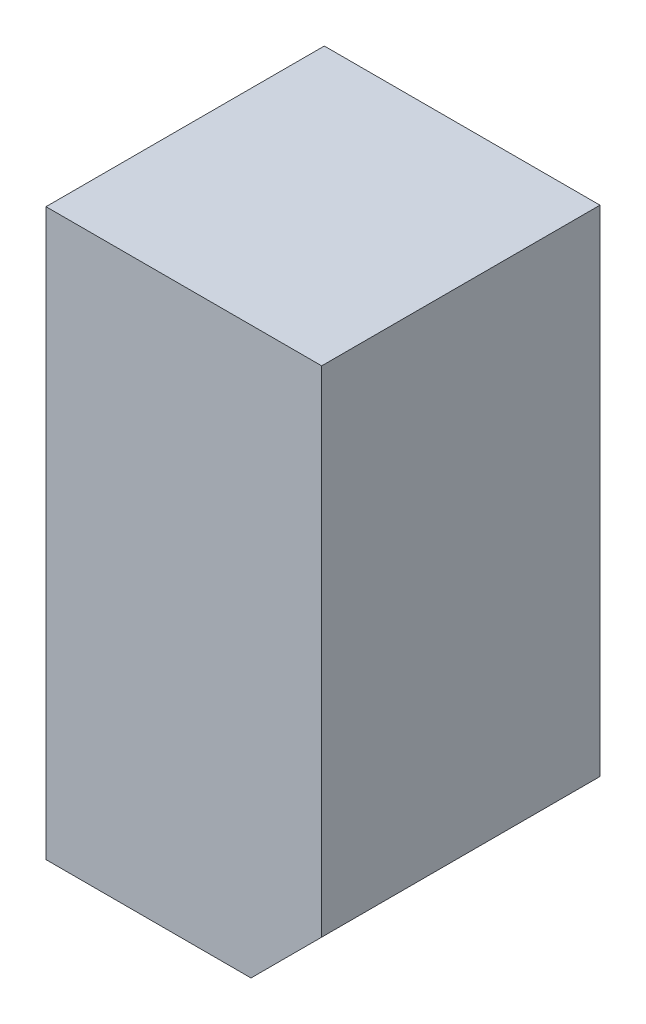
ISO-10303-21;
HEADER;
FILE_DESCRIPTION(('STEP AP214'),'2;1');
FILE_NAME('part.step','',(''),(''),'','','');
FILE_SCHEMA(('AUTOMOTIVE_DESIGN { 1 0 10303 214 1 1 1 1 }'));
ENDSEC;
DATA;
#1=APPLICATION_CONTEXT('core data for automotive mechanical design processes');
#2=APPLICATION_PROTOCOL_DEFINITION('international standard','automotive_design',2000,#1);
#3=PRODUCT_CONTEXT('',#1,'mechanical');
#4=PRODUCT('Part','Part','',(#3));
#5=PRODUCT_RELATED_PRODUCT_CATEGORY('part','',(#4));
#6=PRODUCT_DEFINITION_FORMATION('','',#4);
#7=PRODUCT_DEFINITION_CONTEXT('part definition',#1,'design');
#8=PRODUCT_DEFINITION('design','',#6,#7);
#9=PRODUCT_DEFINITION_SHAPE('','',#8);
#10=(LENGTH_UNIT() NAMED_UNIT(*) SI_UNIT(.MILLI.,.METRE.));
#11=(NAMED_UNIT(*) PLANE_ANGLE_UNIT() SI_UNIT($,.RADIAN.));
#12=(NAMED_UNIT(*) SI_UNIT($,.STERADIAN.) SOLID_ANGLE_UNIT());
#13=UNCERTAINTY_MEASURE_WITH_UNIT(LENGTH_MEASURE(1.E-05),#10,'distance_accuracy_value','');
#14=(GEOMETRIC_REPRESENTATION_CONTEXT(3) GLOBAL_UNCERTAINTY_ASSIGNED_CONTEXT((#13)) GLOBAL_UNIT_ASSIGNED_CONTEXT((#10,
#11,#12)) REPRESENTATION_CONTEXT('',''));
#15=CARTESIAN_POINT('',(0.,0.,0.));
#16=DIRECTION('',(0.,0.,1.));
#17=DIRECTION('',(1.,0.,0.));
#18=AXIS2_PLACEMENT_3D('',#15,#16,#17);
#19=CARTESIAN_POINT('',(2.4765,-3.81,0.));
#20=DIRECTION('',(0.707106781186548,-0.707106781186548,0.));
#21=DIRECTION('',(0.707106781186548,0.707106781186548,0.));
#22=AXIS2_PLACEMENT_3D('',#19,#20,#21);
#23=PLANE('',#22);
#24=DIRECTION('',(0.,0.,-1.));
#25=VECTOR('',#24,1.);
#26=CARTESIAN_POINT('',(1.2065,-5.08,0.));
#27=LINE('',#26,#25);
#28=CARTESIAN_POINT('',(1.2065,-5.08,0.));
#29=VERTEX_POINT('',#28);
#30=CARTESIAN_POINT('',(1.2065,-5.08,5.));
#31=VERTEX_POINT('',#30);
#32=EDGE_CURVE('E66',#29,#31,#27,.F.);
#33=ORIENTED_EDGE('',*,*,#32,.F.);
#34=DIRECTION('',(0.707106781186548,0.707106781186548,0.));
#35=VECTOR('',#34,1.);
#36=CARTESIAN_POINT('',(1.2065,-5.08,0.));
#37=LINE('',#36,#35);
#38=CARTESIAN_POINT('',(2.4765,-3.81,0.));
#39=VERTEX_POINT('',#38);
#40=EDGE_CURVE('E92',#29,#39,#37,.T.);
#41=ORIENTED_EDGE('',*,*,#40,.T.);
#42=DIRECTION('',(0.,0.,-1.));
#43=VECTOR('',#42,1.);
#44=CARTESIAN_POINT('',(2.4765,-3.81,0.));
#45=LINE('',#44,#43);
#46=CARTESIAN_POINT('',(2.4765,-3.81,5.));
#47=VERTEX_POINT('',#46);
#48=EDGE_CURVE('E20',#47,#39,#45,.T.);
#49=ORIENTED_EDGE('',*,*,#48,.F.);
#50=DIRECTION('',(0.707106781186548,0.707106781186548,0.));
#51=VECTOR('',#50,1.);
#52=CARTESIAN_POINT('',(1.2065,-5.08,5.));
#53=LINE('',#52,#51);
#54=EDGE_CURVE('E75',#31,#47,#53,.T.);
#55=ORIENTED_EDGE('',*,*,#54,.F.);
#56=EDGE_LOOP('',(#33,#41,#49,#55));
#57=FACE_BOUND('',#56,.T.);
#58=ADVANCED_FACE('F17',(#57),#23,.T.);
#59=CARTESIAN_POINT('',(2.4765,5.08,0.));
#60=DIRECTION('',(1.,0.,0.));
#61=DIRECTION('',(0.,0.,-1.));
#62=AXIS2_PLACEMENT_3D('',#59,#60,#61);
#63=PLANE('',#62);
#64=ORIENTED_EDGE('',*,*,#48,.T.);
#65=DIRECTION('',(0.,1.,0.));
#66=VECTOR('',#65,1.);
#67=CARTESIAN_POINT('',(2.4765,-5.08,0.));
#68=LINE('',#67,#66);
#69=CARTESIAN_POINT('',(2.4765,5.08,0.));
#70=VERTEX_POINT('',#69);
#71=EDGE_CURVE('E94',#39,#70,#68,.T.);
#72=ORIENTED_EDGE('',*,*,#71,.T.);
#73=DIRECTION('',(0.,0.,1.));
#74=VECTOR('',#73,1.);
#75=CARTESIAN_POINT('',(2.4765,5.08,0.));
#76=LINE('',#75,#74);
#77=CARTESIAN_POINT('',(2.4765,5.08,5.));
#78=VERTEX_POINT('',#77);
#79=EDGE_CURVE('E89',#78,#70,#76,.F.);
#80=ORIENTED_EDGE('',*,*,#79,.F.);
#81=DIRECTION('',(0.,1.,0.));
#82=VECTOR('',#81,1.);
#83=CARTESIAN_POINT('',(2.4765,-5.08,5.));
#84=LINE('',#83,#82);
#85=EDGE_CURVE('E77',#47,#78,#84,.T.);
#86=ORIENTED_EDGE('',*,*,#85,.F.);
#87=EDGE_LOOP('',(#64,#72,#80,#86));
#88=FACE_BOUND('',#87,.T.);
#89=ADVANCED_FACE('F106',(#88),#63,.T.);
#90=CARTESIAN_POINT('',(1.2065,-5.08,0.));
#91=DIRECTION('',(0.,-1.,0.));
#92=DIRECTION('',(0.,0.,-1.));
#93=AXIS2_PLACEMENT_3D('',#90,#91,#92);
#94=PLANE('',#93);
#95=DIRECTION('',(0.,0.,1.));
#96=VECTOR('',#95,1.);
#97=CARTESIAN_POINT('',(-2.4765,-5.08,0.));
#98=LINE('',#97,#96);
#99=CARTESIAN_POINT('',(-2.4765,-5.08,0.));
#100=VERTEX_POINT('',#99);
#101=CARTESIAN_POINT('',(-2.4765,-5.08,5.));
#102=VERTEX_POINT('',#101);
#103=EDGE_CURVE('E97',#100,#102,#98,.T.);
#104=ORIENTED_EDGE('',*,*,#103,.F.);
#105=DIRECTION('',(1.,0.,0.));
#106=VECTOR('',#105,1.);
#107=CARTESIAN_POINT('',(-2.4765,-5.08,0.));
#108=LINE('',#107,#106);
#109=EDGE_CURVE('E72',#100,#29,#108,.T.);
#110=ORIENTED_EDGE('',*,*,#109,.T.);
#111=ORIENTED_EDGE('',*,*,#32,.T.);
#112=DIRECTION('',(1.,0.,0.));
#113=VECTOR('',#112,1.);
#114=CARTESIAN_POINT('',(-2.4765,-5.08,5.));
#115=LINE('',#114,#113);
#116=EDGE_CURVE('E69',#102,#31,#115,.T.);
#117=ORIENTED_EDGE('',*,*,#116,.F.);
#118=EDGE_LOOP('',(#104,#110,#111,#117));
#119=FACE_BOUND('',#118,.T.);
#120=ADVANCED_FACE('F67',(#119),#94,.T.);
#121=CARTESIAN_POINT('',(-2.4765,-5.08,5.));
#122=DIRECTION('',(0.,0.,1.));
#123=DIRECTION('',(1.,0.,0.));
#124=AXIS2_PLACEMENT_3D('',#121,#122,#123);
#125=PLANE('',#124);
#126=DIRECTION('',(1.,0.,0.));
#127=VECTOR('',#126,1.);
#128=CARTESIAN_POINT('',(-2.4765,5.08,5.));
#129=LINE('',#128,#127);
#130=CARTESIAN_POINT('',(-2.4765,5.08,5.));
#131=VERTEX_POINT('',#130);
#132=EDGE_CURVE('E86',#131,#78,#129,.T.);
#133=ORIENTED_EDGE('',*,*,#132,.F.);
#134=DIRECTION('',(0.,1.,0.));
#135=VECTOR('',#134,1.);
#136=CARTESIAN_POINT('',(-2.4765,-5.08,5.));
#137=LINE('',#136,#135);
#138=EDGE_CURVE('E81',#102,#131,#137,.T.);
#139=ORIENTED_EDGE('',*,*,#138,.F.);
#140=ORIENTED_EDGE('',*,*,#116,.T.);
#141=ORIENTED_EDGE('',*,*,#54,.T.);
#142=ORIENTED_EDGE('',*,*,#85,.T.);
#143=EDGE_LOOP('',(#133,#139,#140,#141,#142));
#144=FACE_BOUND('',#143,.T.);
#145=ADVANCED_FACE('F79',(#144),#125,.T.);
#146=CARTESIAN_POINT('',(-2.4765,5.08,0.));
#147=DIRECTION('',(0.,1.,0.));
#148=DIRECTION('',(0.,0.,1.));
#149=AXIS2_PLACEMENT_3D('',#146,#147,#148);
#150=PLANE('',#149);
#151=ORIENTED_EDGE('',*,*,#79,.T.);
#152=DIRECTION('',(1.,0.,0.));
#153=VECTOR('',#152,1.);
#154=CARTESIAN_POINT('',(-2.4765,5.08,0.));
#155=LINE('',#154,#153);
#156=CARTESIAN_POINT('',(-2.4765,5.08,0.));
#157=VERTEX_POINT('',#156);
#158=EDGE_CURVE('E35',#70,#157,#155,.F.);
#159=ORIENTED_EDGE('',*,*,#158,.T.);
#160=DIRECTION('',(0.,0.,1.));
#161=VECTOR('',#160,1.);
#162=CARTESIAN_POINT('',(-2.4765,5.08,0.));
#163=LINE('',#162,#161);
#164=EDGE_CURVE('E26',#131,#157,#163,.F.);
#165=ORIENTED_EDGE('',*,*,#164,.F.);
#166=ORIENTED_EDGE('',*,*,#132,.T.);
#167=EDGE_LOOP('',(#151,#159,#165,#166));
#168=FACE_BOUND('',#167,.T.);
#169=ADVANCED_FACE('F103',(#168),#150,.T.);
#170=CARTESIAN_POINT('',(-2.4765,-5.08,0.));
#171=DIRECTION('',(0.,0.,1.));
#172=DIRECTION('',(1.,0.,0.));
#173=AXIS2_PLACEMENT_3D('',#170,#171,#172);
#174=PLANE('',#173);
#175=ORIENTED_EDGE('',*,*,#158,.F.);
#176=ORIENTED_EDGE('',*,*,#71,.F.);
#177=ORIENTED_EDGE('',*,*,#40,.F.);
#178=ORIENTED_EDGE('',*,*,#109,.F.);
#179=DIRECTION('',(0.,1.,0.));
#180=VECTOR('',#179,1.);
#181=CARTESIAN_POINT('',(-2.4765,-5.08,0.));
#182=LINE('',#181,#180);
#183=EDGE_CURVE('E11',#157,#100,#182,.F.);
#184=ORIENTED_EDGE('',*,*,#183,.F.);
#185=EDGE_LOOP('',(#175,#176,#177,#178,#184));
#186=FACE_BOUND('',#185,.T.);
#187=ADVANCED_FACE('F109',(#186),#174,.F.);
#188=CARTESIAN_POINT('',(-2.4765,-5.08,0.));
#189=DIRECTION('',(-1.,0.,0.));
#190=DIRECTION('',(0.,0.,1.));
#191=AXIS2_PLACEMENT_3D('',#188,#189,#190);
#192=PLANE('',#191);
#193=ORIENTED_EDGE('',*,*,#164,.T.);
#194=ORIENTED_EDGE('',*,*,#183,.T.);
#195=ORIENTED_EDGE('',*,*,#103,.T.);
#196=ORIENTED_EDGE('',*,*,#138,.T.);
#197=EDGE_LOOP('',(#193,#194,#195,#196));
#198=FACE_BOUND('',#197,.T.);
#199=ADVANCED_FACE('F102',(#198),#192,.T.);
#200=CLOSED_SHELL('',(#58,#89,#120,#145,#169,#187,#199));
#201=MANIFOLD_SOLID_BREP('B1',#200);
#202=ADVANCED_BREP_SHAPE_REPRESENTATION('',(#18,#201),#14);
#203=SHAPE_DEFINITION_REPRESENTATION(#9,#202);
ENDSEC;
END-ISO-10303-21;
